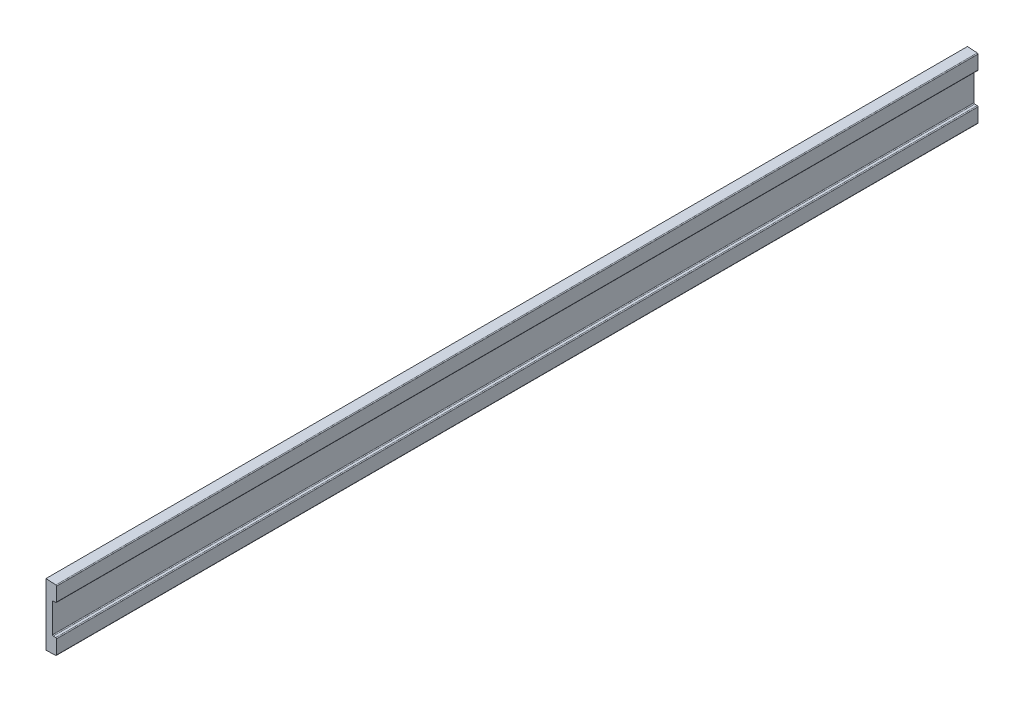
ISO-10303-21;
HEADER;
FILE_DESCRIPTION(('STEP AP214'),'2;1');
FILE_NAME('part.step','',(''),(''),'','','');
FILE_SCHEMA(('AUTOMOTIVE_DESIGN { 1 0 10303 214 1 1 1 1 }'));
ENDSEC;
DATA;
#1=APPLICATION_CONTEXT('core data for automotive mechanical design processes');
#2=APPLICATION_PROTOCOL_DEFINITION('international standard','automotive_design',2000,#1);
#3=PRODUCT_CONTEXT('',#1,'mechanical');
#4=PRODUCT('Part','Part','',(#3));
#5=PRODUCT_RELATED_PRODUCT_CATEGORY('part','',(#4));
#6=PRODUCT_DEFINITION_FORMATION('','',#4);
#7=PRODUCT_DEFINITION_CONTEXT('part definition',#1,'design');
#8=PRODUCT_DEFINITION('design','',#6,#7);
#9=PRODUCT_DEFINITION_SHAPE('','',#8);
#10=(LENGTH_UNIT() NAMED_UNIT(*) SI_UNIT(.MILLI.,.METRE.));
#11=(NAMED_UNIT(*) PLANE_ANGLE_UNIT() SI_UNIT($,.RADIAN.));
#12=(NAMED_UNIT(*) SI_UNIT($,.STERADIAN.) SOLID_ANGLE_UNIT());
#13=UNCERTAINTY_MEASURE_WITH_UNIT(LENGTH_MEASURE(1.E-05),#10,'distance_accuracy_value','');
#14=(GEOMETRIC_REPRESENTATION_CONTEXT(3) GLOBAL_UNCERTAINTY_ASSIGNED_CONTEXT((#13)) GLOBAL_UNIT_ASSIGNED_CONTEXT((#10,
#11,#12)) REPRESENTATION_CONTEXT('',''));
#15=CARTESIAN_POINT('',(0.,0.,0.));
#16=DIRECTION('',(0.,0.,1.));
#17=DIRECTION('',(1.,0.,0.));
#18=AXIS2_PLACEMENT_3D('',#15,#16,#17);
#19=CARTESIAN_POINT('',(152.4,0.,177.8));
#20=CARTESIAN_POINT('',(152.232833718495,0.0185024145844094,177.8));
#21=CARTESIAN_POINT('',(151.571843934071,0.0916625454276125,177.8));
#22=CARTESIAN_POINT('',(150.11399955714,0.283859600165364,177.8));
#23=CARTESIAN_POINT('',(147.749385864208,0.638650628689324,177.8));
#24=CARTESIAN_POINT('',(144.555943785527,1.17015700229937,177.8));
#25=CARTESIAN_POINT('',(140.615360499081,1.85909924705757,177.8));
#26=CARTESIAN_POINT('',(136.007834995224,2.67146012975516,177.8));
#27=CARTESIAN_POINT('',(130.806388018581,3.56284001663103,177.8));
#28=CARTESIAN_POINT('',(125.073826155466,4.48615477740971,177.8));
#29=CARTESIAN_POINT('',(118.8646901353,5.39775327756707,177.8));
#30=CARTESIAN_POINT('',(112.233312125261,6.27297423591478,177.8));
#31=CARTESIAN_POINT('',(105.243489487442,7.10605889156724,177.8));
#32=CARTESIAN_POINT('',(97.9696654062804,7.88931969327321,177.8));
#33=CARTESIAN_POINT('',(90.4927249927246,8.60673485806436,177.8));
#34=CARTESIAN_POINT('',(82.8952532405217,9.2406702507931,177.8));
#35=CARTESIAN_POINT('',(75.2586679023908,9.77749908015344,177.8));
#36=CARTESIAN_POINT('',(67.6629284232157,10.1988157178373,177.8));
#37=CARTESIAN_POINT('',(60.1868274986299,10.4917010195868,177.8));
#38=CARTESIAN_POINT('',(52.9059459542408,10.6450800985298,177.8));
#39=CARTESIAN_POINT('',(45.8917437129946,10.6445518064523,177.8));
#40=CARTESIAN_POINT('',(39.2106810479072,10.4862475970987,177.8));
#41=CARTESIAN_POINT('',(32.923263797137,10.1644127111138,177.8));
#42=CARTESIAN_POINT('',(27.0837008540271,9.67093972647032,177.8));
#43=CARTESIAN_POINT('',(21.737197539699,9.01650809069112,177.8));
#44=CARTESIAN_POINT('',(16.9243447592619,8.20408197388868,177.8));
#45=CARTESIAN_POINT('',(12.6762753048712,7.24977047946681,177.8));
#46=CARTESIAN_POINT('',(9.01981569255257,6.17445777095632,177.8));
#47=CARTESIAN_POINT('',(5.96569481917708,5.00201852215155,177.8));
#48=CARTESIAN_POINT('',(3.54403253695888,3.76987152616717,177.8));
#49=CARTESIAN_POINT('',(1.70483470840094,2.53149972603197,177.8));
#50=CARTESIAN_POINT('',(0.575239505776366,1.34473752883143,177.8));
#51=CARTESIAN_POINT('',(-0.170728015466049,0.203106959768801,177.8));
#52=CARTESIAN_POINT('',(0.337603285303623,-1.00177222805816,177.8));
#53=CARTESIAN_POINT('',(1.79294322608063,-1.54672679451716,177.8));
#54=CARTESIAN_POINT('',(3.794232234597,-2.17716445974196,177.8));
#55=CARTESIAN_POINT('',(6.64340020089969,-2.64392231576436,177.8));
#56=CARTESIAN_POINT('',(10.2161106536038,-3.04195363150428,177.8));
#57=CARTESIAN_POINT('',(14.5300841872538,-3.31987222771604,177.8));
#58=CARTESIAN_POINT('',(19.5339696288078,-3.49767725483492,177.8));
#59=CARTESIAN_POINT('',(25.1869220599411,-3.57763834503169,177.8));
#60=CARTESIAN_POINT('',(31.42862727455,-3.57384808178261,177.8));
#61=CARTESIAN_POINT('',(38.191948203283,-3.49658144160037,177.8));
#62=CARTESIAN_POINT('',(45.4015953170636,-3.34930898576548,177.8));
#63=CARTESIAN_POINT('',(52.9784172595709,-3.14184128811128,177.8));
#64=CARTESIAN_POINT('',(60.8386741403337,-2.88526226056694,177.8));
#65=CARTESIAN_POINT('',(68.8949884243473,-2.58793090460575,177.8));
#66=CARTESIAN_POINT('',(77.057432025165,-2.25888288701279,177.8));
#67=CARTESIAN_POINT('',(85.2350096722083,-1.90773028344113,177.8));
#68=CARTESIAN_POINT('',(93.3354268335371,-1.55016881909302,177.8));
#69=CARTESIAN_POINT('',(101.266049648543,-1.19546522084977,177.8));
#70=CARTESIAN_POINT('',(108.934170809505,-0.862411005508114,177.8));
#71=CARTESIAN_POINT('',(116.246498600348,-0.557504044589403,177.8));
#72=CARTESIAN_POINT('',(123.110150898588,-0.3069361826572,177.8));
#73=CARTESIAN_POINT('',(129.431690532645,-0.107922528146747,177.8));
#74=CARTESIAN_POINT('',(135.123521438346,0.0279744509983298,177.8));
#75=CARTESIAN_POINT('',(140.103603919286,0.108900524885163,177.8));
#76=CARTESIAN_POINT('',(144.299415419815,0.139938590331548,177.8));
#77=CARTESIAN_POINT('',(147.644768246445,0.124243060792821,177.8));
#78=CARTESIAN_POINT('',(150.083437285214,0.0865028877410205,177.8));
#79=CARTESIAN_POINT('',(151.399782071317,0.0403495604636981,177.8));
#80=CARTESIAN_POINT('',(151.898604,0.02286,177.8));
#81=B_SPLINE_CURVE_WITH_KNOTS('',3,(#19,#20,#21,#22,#23,#24,#25,#26,#27,#28,#29,#30,#31,#32,#33,
#34,#35,#36,#37,#38,#39,#40,#41,#42,#43,#44,#45,#46,#47,#48,#49,#50,#51,#52,#53,#54,#55,#56,#57,
#58,#59,#60,#61,#62,#63,#64,#65,#66,#67,#68,#69,#70,#71,#72,#73,#74,#75,#76,#77,#78,#79,#80),
.UNSPECIFIED.,.F.,.F.,(4,1,1,1,1,1,1,1,1,1,1,1,1,1,1,1,1,1,1,1,1,1,1,1,1,1,1,1,1,1,1,1,1,1,1,1,
1,1,1,1,1,1,1,1,1,1,1,1,1,1,1,1,1,1,1,1,1,1,1,4),(0.,0.00163535583425865,0.00646633693476808,
0.0142965918772176,0.0248842088552096,0.0379439925510076,0.0531941368467982,0.0703765688743697,
0.0892572179770476,0.109651763058439,0.131396199224683,0.154294670265703,0.178096902835303,
0.202530723472683,0.227328973387424,0.25222580652472,0.276966075496197,0.301296827478668,
0.324972088966137,0.347773045551505,0.369493848961825,0.389946984550237,0.40897941596321,
0.426465789850067,0.442306728816157,0.456421239565711,0.46877353813753,0.47934514980936,
0.488155641306995,0.495223141471028,0.500608247512498,0.504417035913407,0.507344225330662,
0.511892730711683,0.518766332626908,0.528062399813873,0.5397504852938,0.553781923901918,
0.570059197087642,0.588441486429501,0.608747967256935,0.630750043644814,0.654207709776473,
0.678865071069041,0.704450570233279,0.73067750330715,0.757253936726054,0.783882586633168,
0.810265561255861,0.836095192051152,0.861073222293053,0.884896986100605,0.907258357413886,
0.927856250220039,0.946394646161361,0.962618153964165,0.976286171395788,0.987192827864271,
0.995146789524168,1.),.UNSPECIFIED.);
#82=DIRECTION('',(0.,0.,-1.));
#83=VECTOR('',#82,1.);
#84=SURFACE_OF_LINEAR_EXTRUSION('',#81,#83);
#85=CARTESIAN_POINT('',(78.0840603378274,9.57328992321587,177.8));
#86=VERTEX_POINT('',#85);
#87=CARTESIAN_POINT('',(76.2000000191939,9.69855577172151,177.8));
#88=VERTEX_POINT('',#87);
#89=EDGE_CURVE('E259',#86,#88,#81,.T.);
#90=ORIENTED_EDGE('',*,*,#89,.F.);
#91=DIRECTION('',(0.,0.,-1.));
#92=VECTOR('',#91,1.);
#93=CARTESIAN_POINT('',(78.0840603378273,9.57328992321588,177.8));
#94=LINE('',#93,#92);
#95=CARTESIAN_POINT('',(78.0840636575245,9.5733387320603,0.));
#96=VERTEX_POINT('',#95);
#97=EDGE_CURVE('E326',#86,#96,#94,.T.);
#98=ORIENTED_EDGE('',*,*,#97,.T.);
#99=CARTESIAN_POINT('',(78.0840603300282,9.5732899237482,0.));
#100=CARTESIAN_POINT('',(77.4561143375636,9.61615041171389,0.));
#101=CARTESIAN_POINT('',(76.8280937362639,9.65791669397192,0.));
#102=CARTESIAN_POINT('',(76.1999998600843,9.69855578201625,0.));
#103=B_SPLINE_CURVE_WITH_KNOTS('',3,(#99,#100,#101,#102),.UNSPECIFIED.,.F.,.F.,(4,4),
(0.242992540667754,0.249112544207263),.UNSPECIFIED.);
#104=CARTESIAN_POINT('',(76.1999999916468,9.69855658356956,-0.00024919249397366));
#105=VERTEX_POINT('',#104);
#106=EDGE_CURVE('E216',#96,#105,#103,.T.);
#107=ORIENTED_EDGE('',*,*,#106,.T.);
#108=DIRECTION('',(0.,0.,1.));
#109=VECTOR('',#108,1.);
#110=CARTESIAN_POINT('',(76.2000000191939,9.69855577172151,-0.001000000000001));
#111=LINE('',#110,#109);
#112=EDGE_CURVE('E193',#105,#88,#111,.T.);
#113=ORIENTED_EDGE('',*,*,#112,.T.);
#114=EDGE_LOOP('',(#90,#98,#107,#113));
#115=FACE_BOUND('',#114,.T.);
#116=ADVANCED_FACE('F83',(#115),#84,.F.);
#117=CARTESIAN_POINT('',(76.2000028591815,-2.29086360758506,0.));
#118=CARTESIAN_POINT('',(76.4839755544026,-2.279121928277,0.));
#119=CARTESIAN_POINT('',(77.11061309081,-2.25312349846076,0.));
#120=CARTESIAN_POINT('',(77.7372427157906,-2.22693660902456,0.));
#121=CARTESIAN_POINT('',(78.0799026789359,-2.21256420568276,0.));
#122=B_SPLINE_CURVE_WITH_KNOTS('',3,(#117,#118,#119,#120,#121),.UNSPECIFIED.,.F.,.F.,(4,1,4),
(0.754490364317118,0.757253936726054,0.760588726444605),.UNSPECIFIED.);
#123=CARTESIAN_POINT('',(76.2000004191948,-2.29083681989652,-0.000224048710782881));
#124=VERTEX_POINT('',#123);
#125=CARTESIAN_POINT('',(78.0798974354604,-2.21243947086954,0.));
#126=VERTEX_POINT('',#125);
#127=EDGE_CURVE('E197',#124,#126,#122,.T.);
#128=ORIENTED_EDGE('',*,*,#127,.T.);
#129=DIRECTION('',(0.,0.,-1.));
#130=VECTOR('',#129,1.);
#131=CARTESIAN_POINT('',(78.079902702184,-2.21256420470766,0.));
#132=LINE('',#131,#130);
#133=CARTESIAN_POINT('',(78.079902702184,-2.21256420470766,177.8));
#134=VERTEX_POINT('',#133);
#135=EDGE_CURVE('E263',#126,#134,#132,.F.);
#136=ORIENTED_EDGE('',*,*,#135,.T.);
#137=CARTESIAN_POINT('',(76.2,-2.29086372580625,177.8));
#138=VERTEX_POINT('',#137);
#139=EDGE_CURVE('E207',#138,#134,#81,.T.);
#140=ORIENTED_EDGE('',*,*,#139,.F.);
#141=DIRECTION('',(0.,0.,1.));
#142=VECTOR('',#141,1.);
#143=CARTESIAN_POINT('',(76.2,-2.29086372580625,-0.000999999999973245));
#144=LINE('',#143,#142);
#145=EDGE_CURVE('E190',#124,#138,#144,.T.);
#146=ORIENTED_EDGE('',*,*,#145,.F.);
#147=EDGE_LOOP('',(#128,#136,#140,#146));
#148=FACE_BOUND('',#147,.T.);
#149=ADVANCED_FACE('F202',(#148),#84,.F.);
#150=CARTESIAN_POINT('',(0.,0.,177.8));
#151=DIRECTION('',(0.,0.,1.));
#152=DIRECTION('',(1.,0.,0.));
#153=AXIS2_PLACEMENT_3D('',#150,#151,#152);
#154=PLANE('',#153);
#155=ORIENTED_EDGE('',*,*,#139,.T.);
#156=CARTESIAN_POINT('',(78.07325,-2.05395366264424,177.8));
#157=DIRECTION('',(0.,0.,1.));
#158=DIRECTION('',(1.,0.,0.));
#159=AXIS2_PLACEMENT_3D('',#156,#157,#158);
#160=CIRCLE('',#159,0.15875);
#161=CARTESIAN_POINT('',(78.232,-2.05395366264424,177.8));
#162=VERTEX_POINT('',#161);
#163=EDGE_CURVE('E284',#134,#162,#160,.T.);
#164=ORIENTED_EDGE('',*,*,#163,.T.);
#165=DIRECTION('',(0.,-1.,0.));
#166=VECTOR('',#165,1.);
#167=CARTESIAN_POINT('',(78.232,0.,177.8));
#168=LINE('',#167,#166);
#169=CARTESIAN_POINT('',(78.232,0.611396023578565,177.8));
#170=VERTEX_POINT('',#169);
#171=EDGE_CURVE('E265',#170,#162,#168,.T.);
#172=ORIENTED_EDGE('',*,*,#171,.F.);
#173=CARTESIAN_POINT('',(78.07325,0.611396023578565,177.8));
#174=DIRECTION('',(0.,0.,1.));
#175=DIRECTION('',(1.,0.,0.));
#176=AXIS2_PLACEMENT_3D('',#173,#174,#175);
#177=CIRCLE('',#176,0.15875);
#178=CARTESIAN_POINT('',(78.07325,0.770146023578565,177.8));
#179=VERTEX_POINT('',#178);
#180=EDGE_CURVE('E278',#170,#179,#177,.T.);
#181=ORIENTED_EDGE('',*,*,#180,.T.);
#182=DIRECTION('',(-1.,0.,0.));
#183=VECTOR('',#182,1.);
#184=CARTESIAN_POINT('',(78.232,0.770146023578565,177.8));
#185=LINE('',#184,#183);
#186=CARTESIAN_POINT('',(77.60335,0.770146023578565,177.8));
#187=VERTEX_POINT('',#186);
#188=EDGE_CURVE('E388',#179,#187,#185,.T.);
#189=ORIENTED_EDGE('',*,*,#188,.T.);
#190=CARTESIAN_POINT('',(77.60335,0.928896023578565,177.8));
#191=DIRECTION('',(0.,0.,1.));
#192=DIRECTION('',(1.,0.,0.));
#193=AXIS2_PLACEMENT_3D('',#190,#191,#192);
#194=CIRCLE('',#193,0.15875);
#195=CARTESIAN_POINT('',(77.4446,0.928896023578566,177.8));
#196=VERTEX_POINT('',#195);
#197=EDGE_CURVE('E351',#187,#196,#194,.F.);
#198=ORIENTED_EDGE('',*,*,#197,.T.);
#199=DIRECTION('',(0.,-1.,0.));
#200=VECTOR('',#199,1.);
#201=CARTESIAN_POINT('',(77.4446,6.63754602357857,177.8));
#202=LINE('',#201,#200);
#203=CARTESIAN_POINT('',(77.4446,6.47879602357857,177.8));
#204=VERTEX_POINT('',#203);
#205=EDGE_CURVE('E362',#204,#196,#202,.T.);
#206=ORIENTED_EDGE('',*,*,#205,.F.);
#207=CARTESIAN_POINT('',(77.60335,6.47879602357857,177.8));
#208=DIRECTION('',(0.,0.,1.));
#209=DIRECTION('',(1.,0.,0.));
#210=AXIS2_PLACEMENT_3D('',#207,#208,#209);
#211=CIRCLE('',#210,0.15875);
#212=CARTESIAN_POINT('',(77.60335,6.63754602357857,177.8));
#213=VERTEX_POINT('',#212);
#214=EDGE_CURVE('E92',#204,#213,#211,.F.);
#215=ORIENTED_EDGE('',*,*,#214,.T.);
#216=DIRECTION('',(-1.,0.,0.));
#217=VECTOR('',#216,1.);
#218=CARTESIAN_POINT('',(78.232,6.63754602357857,177.8));
#219=LINE('',#218,#217);
#220=CARTESIAN_POINT('',(78.07325,6.63754602357857,177.8));
#221=VERTEX_POINT('',#220);
#222=EDGE_CURVE('E360',#221,#213,#219,.T.);
#223=ORIENTED_EDGE('',*,*,#222,.F.);
#224=CARTESIAN_POINT('',(78.07325,6.79629602357857,177.8));
#225=DIRECTION('',(0.,0.,1.));
#226=DIRECTION('',(1.,0.,0.));
#227=AXIS2_PLACEMENT_3D('',#224,#225,#226);
#228=CIRCLE('',#227,0.15875);
#229=CARTESIAN_POINT('',(78.232,6.79629602357857,177.8));
#230=VERTEX_POINT('',#229);
#231=EDGE_CURVE('E275',#221,#230,#228,.T.);
#232=ORIENTED_EDGE('',*,*,#231,.T.);
#233=CARTESIAN_POINT('',(78.232,9.41490842462447,177.8));
#234=VERTEX_POINT('',#233);
#235=EDGE_CURVE('E270',#234,#230,#168,.T.);
#236=ORIENTED_EDGE('',*,*,#235,.F.);
#237=CARTESIAN_POINT('',(78.07325,9.41490842462447,177.8));
#238=DIRECTION('',(0.,0.,1.));
#239=DIRECTION('',(1.,0.,0.));
#240=AXIS2_PLACEMENT_3D('',#237,#238,#239);
#241=CIRCLE('',#240,0.15875);
#242=EDGE_CURVE('E281',#234,#86,#241,.T.);
#243=ORIENTED_EDGE('',*,*,#242,.T.);
#244=ORIENTED_EDGE('',*,*,#89,.T.);
#245=DIRECTION('',(0.,-1.,0.));
#246=VECTOR('',#245,1.);
#247=CARTESIAN_POINT('',(76.2,0.,177.8));
#248=LINE('',#247,#246);
#249=EDGE_CURVE('E380',#88,#138,#248,.T.);
#250=ORIENTED_EDGE('',*,*,#249,.T.);
#251=EDGE_LOOP('',(#155,#164,#172,#181,#189,#198,#206,#215,#223,#232,#236,#243,#244,#250));
#252=FACE_BOUND('',#251,.T.);
#253=ADVANCED_FACE('F238',(#252),#154,.T.);
#254=CARTESIAN_POINT('',(0.,0.,0.));
#255=DIRECTION('',(0.,0.,1.));
#256=DIRECTION('',(1.,0.,0.));
#257=AXIS2_PLACEMENT_3D('',#254,#255,#256);
#258=PLANE('',#257);
#259=DIRECTION('',(0.,1.,0.));
#260=VECTOR('',#259,1.);
#261=CARTESIAN_POINT('',(78.232,0.,0.));
#262=LINE('',#261,#260);
#263=CARTESIAN_POINT('',(78.232,0.611396023578565,0.));
#264=VERTEX_POINT('',#263);
#265=CARTESIAN_POINT('',(78.232,-2.05395366264424,0.));
#266=VERTEX_POINT('',#265);
#267=EDGE_CURVE('E274',#264,#266,#262,.F.);
#268=ORIENTED_EDGE('',*,*,#267,.T.);
#269=CARTESIAN_POINT('',(78.07325,-2.05395366264424,0.));
#270=DIRECTION('',(0.,0.,1.));
#271=DIRECTION('',(1.,0.,0.));
#272=AXIS2_PLACEMENT_3D('',#269,#270,#271);
#273=CIRCLE('',#272,0.15875);
#274=EDGE_CURVE('E214',#266,#126,#273,.F.);
#275=ORIENTED_EDGE('',*,*,#274,.T.);
#276=ORIENTED_EDGE('',*,*,#127,.F.);
#277=DIRECTION('',(0.,1.,0.));
#278=VECTOR('',#277,1.);
#279=CARTESIAN_POINT('',(76.2,0.,0.));
#280=LINE('',#279,#278);
#281=EDGE_CURVE('E186',#105,#124,#280,.F.);
#282=ORIENTED_EDGE('',*,*,#281,.F.);
#283=ORIENTED_EDGE('',*,*,#106,.F.);
#284=CARTESIAN_POINT('',(78.07325,9.41490842462447,0.));
#285=DIRECTION('',(0.,0.,1.));
#286=DIRECTION('',(1.,0.,0.));
#287=AXIS2_PLACEMENT_3D('',#284,#285,#286);
#288=CIRCLE('',#287,0.15875);
#289=CARTESIAN_POINT('',(78.232,9.41490842462447,0.));
#290=VERTEX_POINT('',#289);
#291=EDGE_CURVE('E310',#96,#290,#288,.F.);
#292=ORIENTED_EDGE('',*,*,#291,.T.);
#293=CARTESIAN_POINT('',(78.232,6.79629602357857,0.));
#294=VERTEX_POINT('',#293);
#295=EDGE_CURVE('E290',#290,#294,#262,.F.);
#296=ORIENTED_EDGE('',*,*,#295,.T.);
#297=CARTESIAN_POINT('',(78.07325,6.79629602357857,0.));
#298=DIRECTION('',(0.,0.,1.));
#299=DIRECTION('',(1.,0.,0.));
#300=AXIS2_PLACEMENT_3D('',#297,#298,#299);
#301=CIRCLE('',#300,0.15875);
#302=CARTESIAN_POINT('',(78.07325,6.63754602357857,0.));
#303=VERTEX_POINT('',#302);
#304=EDGE_CURVE('E303',#294,#303,#301,.F.);
#305=ORIENTED_EDGE('',*,*,#304,.T.);
#306=DIRECTION('',(1.,0.,0.));
#307=VECTOR('',#306,1.);
#308=CARTESIAN_POINT('',(78.232,6.63754602357857,0.));
#309=LINE('',#308,#307);
#310=CARTESIAN_POINT('',(77.60335,6.63754602357857,0.));
#311=VERTEX_POINT('',#310);
#312=EDGE_CURVE('E269',#311,#303,#309,.T.);
#313=ORIENTED_EDGE('',*,*,#312,.F.);
#314=CARTESIAN_POINT('',(77.60335,6.47879602357857,0.));
#315=DIRECTION('',(0.,0.,1.));
#316=DIRECTION('',(1.,0.,0.));
#317=AXIS2_PLACEMENT_3D('',#314,#315,#316);
#318=CIRCLE('',#317,0.15875);
#319=CARTESIAN_POINT('',(77.4446,6.47879602357857,0.));
#320=VERTEX_POINT('',#319);
#321=EDGE_CURVE('E12',#311,#320,#318,.T.);
#322=ORIENTED_EDGE('',*,*,#321,.T.);
#323=DIRECTION('',(0.,1.,0.));
#324=VECTOR('',#323,1.);
#325=CARTESIAN_POINT('',(77.4446,6.63754602357857,0.));
#326=LINE('',#325,#324);
#327=CARTESIAN_POINT('',(77.4446,0.928896023578566,0.));
#328=VERTEX_POINT('',#327);
#329=EDGE_CURVE('E294',#328,#320,#326,.T.);
#330=ORIENTED_EDGE('',*,*,#329,.F.);
#331=CARTESIAN_POINT('',(77.60335,0.928896023578565,0.));
#332=DIRECTION('',(0.,0.,1.));
#333=DIRECTION('',(1.,0.,0.));
#334=AXIS2_PLACEMENT_3D('',#331,#332,#333);
#335=CIRCLE('',#334,0.15875);
#336=CARTESIAN_POINT('',(77.60335,0.770146023578565,0.));
#337=VERTEX_POINT('',#336);
#338=EDGE_CURVE('E106',#328,#337,#335,.T.);
#339=ORIENTED_EDGE('',*,*,#338,.T.);
#340=DIRECTION('',(1.,0.,0.));
#341=VECTOR('',#340,1.);
#342=CARTESIAN_POINT('',(78.232,0.770146023578565,0.));
#343=LINE('',#342,#341);
#344=CARTESIAN_POINT('',(78.07325,0.770146023578565,0.));
#345=VERTEX_POINT('',#344);
#346=EDGE_CURVE('E372',#337,#345,#343,.T.);
#347=ORIENTED_EDGE('',*,*,#346,.T.);
#348=CARTESIAN_POINT('',(78.07325,0.611396023578565,0.));
#349=DIRECTION('',(0.,0.,1.));
#350=DIRECTION('',(1.,0.,0.));
#351=AXIS2_PLACEMENT_3D('',#348,#349,#350);
#352=CIRCLE('',#351,0.15875);
#353=EDGE_CURVE('E306',#345,#264,#352,.F.);
#354=ORIENTED_EDGE('',*,*,#353,.T.);
#355=EDGE_LOOP('',(#268,#275,#276,#282,#283,#292,#296,#305,#313,#322,#330,#339,#347,#354));
#356=FACE_BOUND('',#355,.T.);
#357=ADVANCED_FACE('F212',(#356),#258,.F.);
#358=CARTESIAN_POINT('',(78.232,0.,-0.00100000000002876));
#359=DIRECTION('',(-1.,0.,0.));
#360=DIRECTION('',(0.,0.,1.));
#361=AXIS2_PLACEMENT_3D('',#358,#359,#360);
#362=PLANE('',#361);
#363=ORIENTED_EDGE('',*,*,#295,.F.);
#364=DIRECTION('',(0.,0.,-1.));
#365=VECTOR('',#364,1.);
#366=CARTESIAN_POINT('',(78.232,9.41490842462447,-0.00100000000002876));
#367=LINE('',#366,#365);
#368=EDGE_CURVE('E322',#290,#234,#367,.F.);
#369=ORIENTED_EDGE('',*,*,#368,.T.);
#370=ORIENTED_EDGE('',*,*,#235,.T.);
#371=DIRECTION('',(0.,0.,1.));
#372=VECTOR('',#371,1.);
#373=CARTESIAN_POINT('',(78.232,6.79629602357857,-0.00100000000002876));
#374=LINE('',#373,#372);
#375=EDGE_CURVE('E317',#230,#294,#374,.F.);
#376=ORIENTED_EDGE('',*,*,#375,.T.);
#377=EDGE_LOOP('',(#363,#369,#370,#376));
#378=FACE_BOUND('',#377,.T.);
#379=ADVANCED_FACE('F237',(#378),#362,.F.);
#380=ORIENTED_EDGE('',*,*,#171,.T.);
#381=DIRECTION('',(0.,0.,-1.));
#382=VECTOR('',#381,1.);
#383=CARTESIAN_POINT('',(78.232,-2.05395366264424,-0.00100000000002876));
#384=LINE('',#383,#382);
#385=EDGE_CURVE('E307',#162,#266,#384,.T.);
#386=ORIENTED_EDGE('',*,*,#385,.T.);
#387=ORIENTED_EDGE('',*,*,#267,.F.);
#388=DIRECTION('',(0.,0.,1.));
#389=VECTOR('',#388,1.);
#390=CARTESIAN_POINT('',(78.232,0.611396023578565,177.8));
#391=LINE('',#390,#389);
#392=EDGE_CURVE('E287',#264,#170,#391,.T.);
#393=ORIENTED_EDGE('',*,*,#392,.T.);
#394=EDGE_LOOP('',(#380,#386,#387,#393));
#395=FACE_BOUND('',#394,.T.);
#396=ADVANCED_FACE('F413',(#395),#362,.F.);
#397=CARTESIAN_POINT('',(77.4446,6.63754602357857,-0.00100000000002876));
#398=DIRECTION('',(-1.,0.,0.));
#399=DIRECTION('',(0.,0.,1.));
#400=AXIS2_PLACEMENT_3D('',#397,#398,#399);
#401=PLANE('',#400);
#402=ORIENTED_EDGE('',*,*,#205,.T.);
#403=DIRECTION('',(0.,0.,1.));
#404=VECTOR('',#403,1.);
#405=CARTESIAN_POINT('',(77.4446,0.928896023578566,-0.00100000000002876));
#406=LINE('',#405,#404);
#407=EDGE_CURVE('E341',#196,#328,#406,.F.);
#408=ORIENTED_EDGE('',*,*,#407,.T.);
#409=ORIENTED_EDGE('',*,*,#329,.T.);
#410=DIRECTION('',(0.,0.,1.));
#411=VECTOR('',#410,1.);
#412=CARTESIAN_POINT('',(77.4446,6.47879602357857,177.8));
#413=LINE('',#412,#411);
#414=EDGE_CURVE('E337',#320,#204,#413,.T.);
#415=ORIENTED_EDGE('',*,*,#414,.T.);
#416=EDGE_LOOP('',(#402,#408,#409,#415));
#417=FACE_BOUND('',#416,.T.);
#418=ADVANCED_FACE('F377',(#417),#401,.F.);
#419=CARTESIAN_POINT('',(78.232,0.770146023578565,-0.00100000000002876));
#420=DIRECTION('',(0.,1.,0.));
#421=DIRECTION('',(-1.,0.,0.));
#422=AXIS2_PLACEMENT_3D('',#419,#420,#421);
#423=PLANE('',#422);
#424=ORIENTED_EDGE('',*,*,#188,.F.);
#425=DIRECTION('',(0.,0.,1.));
#426=VECTOR('',#425,1.);
#427=CARTESIAN_POINT('',(78.07325,0.770146023578565,0.));
#428=LINE('',#427,#426);
#429=EDGE_CURVE('E99',#179,#345,#428,.F.);
#430=ORIENTED_EDGE('',*,*,#429,.T.);
#431=ORIENTED_EDGE('',*,*,#346,.F.);
#432=DIRECTION('',(0.,0.,1.));
#433=VECTOR('',#432,1.);
#434=CARTESIAN_POINT('',(77.60335,0.770146023578565,-0.00100000000002876));
#435=LINE('',#434,#433);
#436=EDGE_CURVE('E329',#337,#187,#435,.T.);
#437=ORIENTED_EDGE('',*,*,#436,.T.);
#438=EDGE_LOOP('',(#424,#430,#431,#437));
#439=FACE_BOUND('',#438,.T.);
#440=ADVANCED_FACE('F239',(#439),#423,.T.);
#441=CARTESIAN_POINT('',(78.232,6.63754602357857,-0.00100000000002876));
#442=DIRECTION('',(0.,1.,0.));
#443=DIRECTION('',(-1.,0.,0.));
#444=AXIS2_PLACEMENT_3D('',#441,#442,#443);
#445=PLANE('',#444);
#446=ORIENTED_EDGE('',*,*,#312,.T.);
#447=DIRECTION('',(0.,0.,1.));
#448=VECTOR('',#447,1.);
#449=CARTESIAN_POINT('',(78.07325,6.63754602357857,-0.00100000000002876));
#450=LINE('',#449,#448);
#451=EDGE_CURVE('E347',#303,#221,#450,.T.);
#452=ORIENTED_EDGE('',*,*,#451,.T.);
#453=ORIENTED_EDGE('',*,*,#222,.T.);
#454=DIRECTION('',(0.,0.,1.));
#455=VECTOR('',#454,1.);
#456=CARTESIAN_POINT('',(77.60335,6.63754602357857,0.));
#457=LINE('',#456,#455);
#458=EDGE_CURVE('E344',#213,#311,#457,.F.);
#459=ORIENTED_EDGE('',*,*,#458,.T.);
#460=EDGE_LOOP('',(#446,#452,#453,#459));
#461=FACE_BOUND('',#460,.T.);
#462=ADVANCED_FACE('F368',(#461),#445,.F.);
#463=CARTESIAN_POINT('',(76.2,0.,-0.00100000000002876));
#464=DIRECTION('',(-1.,0.,0.));
#465=DIRECTION('',(0.,0.,1.));
#466=AXIS2_PLACEMENT_3D('',#463,#464,#465);
#467=PLANE('',#466);
#468=ORIENTED_EDGE('',*,*,#145,.T.);
#469=ORIENTED_EDGE('',*,*,#249,.F.);
#470=ORIENTED_EDGE('',*,*,#112,.F.);
#471=ORIENTED_EDGE('',*,*,#281,.T.);
#472=EDGE_LOOP('',(#468,#469,#470,#471));
#473=FACE_BOUND('',#472,.T.);
#474=ADVANCED_FACE('F188',(#473),#467,.T.);
#475=CARTESIAN_POINT('',(78.07325,-2.05395366264424,88.8995));
#476=DIRECTION('',(0.,0.,-1.));
#477=DIRECTION('',(-1.,0.,0.));
#478=AXIS2_PLACEMENT_3D('',#475,#476,#477);
#479=CYLINDRICAL_SURFACE('',#478,0.15875);
#480=ORIENTED_EDGE('',*,*,#274,.F.);
#481=ORIENTED_EDGE('',*,*,#385,.F.);
#482=ORIENTED_EDGE('',*,*,#163,.F.);
#483=ORIENTED_EDGE('',*,*,#135,.F.);
#484=EDGE_LOOP('',(#480,#481,#482,#483));
#485=FACE_BOUND('',#484,.T.);
#486=ADVANCED_FACE('F245',(#485),#479,.T.);
#487=CARTESIAN_POINT('',(78.07325,9.41490842462447,88.8995));
#488=DIRECTION('',(0.,0.,-1.));
#489=DIRECTION('',(-1.,0.,0.));
#490=AXIS2_PLACEMENT_3D('',#487,#488,#489);
#491=CYLINDRICAL_SURFACE('',#490,0.15875);
#492=ORIENTED_EDGE('',*,*,#291,.F.);
#493=ORIENTED_EDGE('',*,*,#97,.F.);
#494=ORIENTED_EDGE('',*,*,#242,.F.);
#495=ORIENTED_EDGE('',*,*,#368,.F.);
#496=EDGE_LOOP('',(#492,#493,#494,#495));
#497=FACE_BOUND('',#496,.T.);
#498=ADVANCED_FACE('F419',(#497),#491,.T.);
#499=CARTESIAN_POINT('',(78.07325,0.611396023578565,-0.00100000000002876));
#500=DIRECTION('',(0.,0.,-1.));
#501=DIRECTION('',(-1.,0.,0.));
#502=AXIS2_PLACEMENT_3D('',#499,#500,#501);
#503=CYLINDRICAL_SURFACE('',#502,0.15875);
#504=ORIENTED_EDGE('',*,*,#353,.F.);
#505=ORIENTED_EDGE('',*,*,#429,.F.);
#506=ORIENTED_EDGE('',*,*,#180,.F.);
#507=ORIENTED_EDGE('',*,*,#392,.F.);
#508=EDGE_LOOP('',(#504,#505,#506,#507));
#509=FACE_BOUND('',#508,.T.);
#510=ADVANCED_FACE('F424',(#509),#503,.T.);
#511=CARTESIAN_POINT('',(77.60335,0.928896023578565,-0.00100000000002876));
#512=DIRECTION('',(0.,0.,1.));
#513=DIRECTION('',(1.,0.,0.));
#514=AXIS2_PLACEMENT_3D('',#511,#512,#513);
#515=CYLINDRICAL_SURFACE('',#514,0.15875);
#516=ORIENTED_EDGE('',*,*,#338,.F.);
#517=ORIENTED_EDGE('',*,*,#407,.F.);
#518=ORIENTED_EDGE('',*,*,#197,.F.);
#519=ORIENTED_EDGE('',*,*,#436,.F.);
#520=EDGE_LOOP('',(#516,#517,#518,#519));
#521=FACE_BOUND('',#520,.T.);
#522=ADVANCED_FACE('F444',(#521),#515,.F.);
#523=CARTESIAN_POINT('',(78.07325,6.79629602357857,-0.00100000000002876));
#524=DIRECTION('',(0.,0.,1.));
#525=DIRECTION('',(1.,0.,0.));
#526=AXIS2_PLACEMENT_3D('',#523,#524,#525);
#527=CYLINDRICAL_SURFACE('',#526,0.15875);
#528=ORIENTED_EDGE('',*,*,#304,.F.);
#529=ORIENTED_EDGE('',*,*,#375,.F.);
#530=ORIENTED_EDGE('',*,*,#231,.F.);
#531=ORIENTED_EDGE('',*,*,#451,.F.);
#532=EDGE_LOOP('',(#528,#529,#530,#531));
#533=FACE_BOUND('',#532,.T.);
#534=ADVANCED_FACE('F449',(#533),#527,.T.);
#535=CARTESIAN_POINT('',(77.60335,6.47879602357857,-0.00100000000002876));
#536=DIRECTION('',(0.,0.,-1.));
#537=DIRECTION('',(-1.,0.,0.));
#538=AXIS2_PLACEMENT_3D('',#535,#536,#537);
#539=CYLINDRICAL_SURFACE('',#538,0.15875);
#540=ORIENTED_EDGE('',*,*,#321,.F.);
#541=ORIENTED_EDGE('',*,*,#458,.F.);
#542=ORIENTED_EDGE('',*,*,#214,.F.);
#543=ORIENTED_EDGE('',*,*,#414,.F.);
#544=EDGE_LOOP('',(#540,#541,#542,#543));
#545=FACE_BOUND('',#544,.T.);
#546=ADVANCED_FACE('F85',(#545),#539,.F.);
#547=CLOSED_SHELL('',(#116,#149,#253,#357,#379,#396,#418,#440,#462,#474,#486,#498,#510,#522,
#534,#546));
#548=MANIFOLD_SOLID_BREP('B2',#547);
#549=ADVANCED_BREP_SHAPE_REPRESENTATION('',(#18,#548),#14);
#550=SHAPE_DEFINITION_REPRESENTATION(#9,#549);
ENDSEC;
END-ISO-10303-21;
